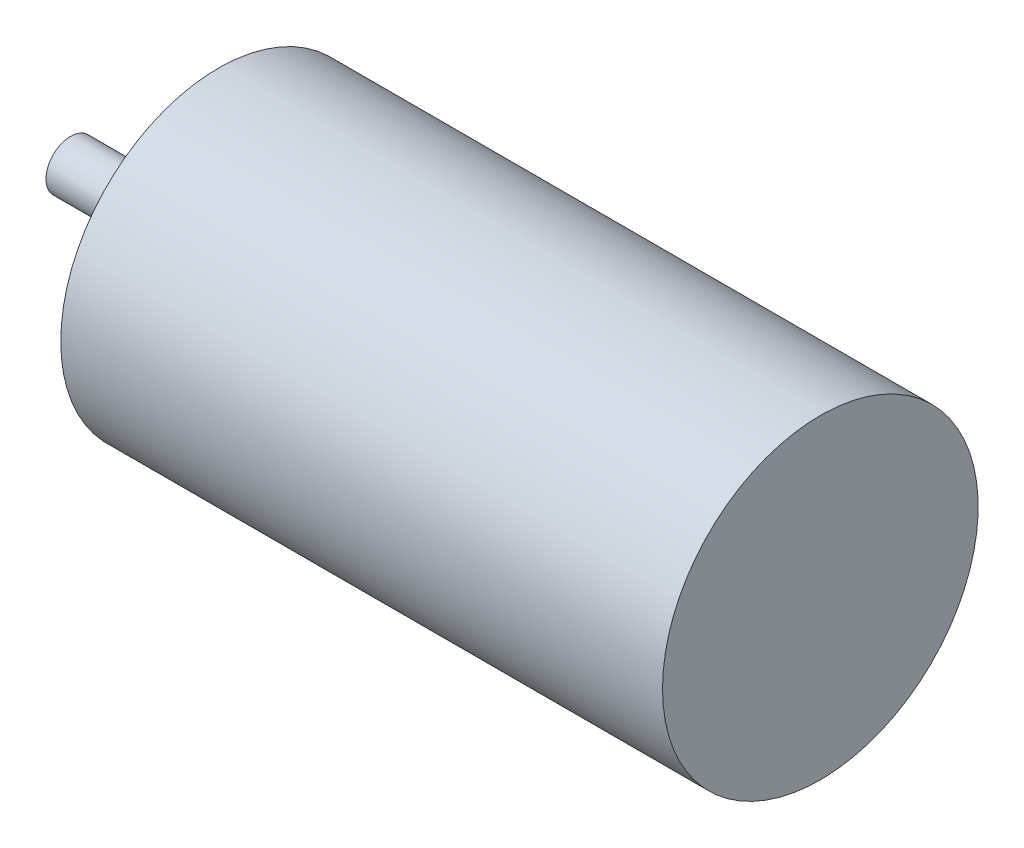
ISO-10303-21;
HEADER;
FILE_DESCRIPTION(('STEP AP214'),'2;1');
FILE_NAME('part.step','',(''),(''),'','','');
FILE_SCHEMA(('AUTOMOTIVE_DESIGN { 1 0 10303 214 1 1 1 1 }'));
ENDSEC;
DATA;
#1=APPLICATION_CONTEXT('core data for automotive mechanical design processes');
#2=APPLICATION_PROTOCOL_DEFINITION('international standard','automotive_design',2000,#1);
#3=PRODUCT_CONTEXT('',#1,'mechanical');
#4=PRODUCT('Part','Part','',(#3));
#5=PRODUCT_RELATED_PRODUCT_CATEGORY('part','',(#4));
#6=PRODUCT_DEFINITION_FORMATION('','',#4);
#7=PRODUCT_DEFINITION_CONTEXT('part definition',#1,'design');
#8=PRODUCT_DEFINITION('design','',#6,#7);
#9=PRODUCT_DEFINITION_SHAPE('','',#8);
#10=(LENGTH_UNIT() NAMED_UNIT(*) SI_UNIT(.MILLI.,.METRE.));
#11=(NAMED_UNIT(*) PLANE_ANGLE_UNIT() SI_UNIT($,.RADIAN.));
#12=(NAMED_UNIT(*) SI_UNIT($,.STERADIAN.) SOLID_ANGLE_UNIT());
#13=UNCERTAINTY_MEASURE_WITH_UNIT(LENGTH_MEASURE(1.E-05),#10,'distance_accuracy_value','');
#14=(GEOMETRIC_REPRESENTATION_CONTEXT(3) GLOBAL_UNCERTAINTY_ASSIGNED_CONTEXT((#13)) GLOBAL_UNIT_ASSIGNED_CONTEXT((#10,
#11,#12)) REPRESENTATION_CONTEXT('',''));
#15=CARTESIAN_POINT('',(0.,0.,0.));
#16=DIRECTION('',(0.,0.,1.));
#17=DIRECTION('',(1.,0.,0.));
#18=AXIS2_PLACEMENT_3D('',#15,#16,#17);
#19=CARTESIAN_POINT('',(61.,0.,0.));
#20=DIRECTION('',(-1.,0.,0.));
#21=DIRECTION('',(0.,0.,1.));
#22=AXIS2_PLACEMENT_3D('',#19,#20,#21);
#23=CYLINDRICAL_SURFACE('',#22,16.);
#24=CARTESIAN_POINT('',(61.,0.,0.));
#25=DIRECTION('',(1.,0.,0.));
#26=DIRECTION('',(0.,0.,-1.));
#27=AXIS2_PLACEMENT_3D('',#24,#25,#26);
#28=CIRCLE('',#27,16.);
#29=CARTESIAN_POINT('',(61.,0.,16.));
#30=VERTEX_POINT('',#29);
#31=EDGE_CURVE('E45',#30,#30,#28,.T.);
#32=CARTESIAN_POINT('',(0.,0.,0.));
#33=DIRECTION('',(1.,0.,0.));
#34=DIRECTION('',(0.,0.,-1.));
#35=AXIS2_PLACEMENT_3D('',#32,#33,#34);
#36=CIRCLE('',#35,16.);
#37=CARTESIAN_POINT('',(0.,0.,16.));
#38=VERTEX_POINT('',#37);
#39=EDGE_CURVE('E36',#38,#38,#36,.T.);
#40=CARTESIAN_POINT('',(61.,0.,16.));
#41=CARTESIAN_POINT('',(60.3645833333333,0.,16.));
#42=CARTESIAN_POINT('',(59.7291666666667,0.,16.));
#43=CARTESIAN_POINT('',(58.4583333333333,0.,16.));
#44=CARTESIAN_POINT('',(57.8229166666667,0.,16.));
#45=CARTESIAN_POINT('',(56.5520833333333,0.,16.));
#46=CARTESIAN_POINT('',(55.9166666666667,0.,16.));
#47=CARTESIAN_POINT('',(54.6458333333333,0.,16.));
#48=CARTESIAN_POINT('',(54.0104166666667,0.,16.));
#49=CARTESIAN_POINT('',(52.7395833333333,0.,16.));
#50=CARTESIAN_POINT('',(52.1041666666667,0.,16.));
#51=CARTESIAN_POINT('',(50.8333333333333,0.,16.));
#52=CARTESIAN_POINT('',(50.1979166666667,0.,16.));
#53=CARTESIAN_POINT('',(48.9270833333333,0.,16.));
#54=CARTESIAN_POINT('',(48.2916666666667,0.,16.));
#55=CARTESIAN_POINT('',(47.0208333333333,0.,16.));
#56=CARTESIAN_POINT('',(46.3854166666667,0.,16.));
#57=CARTESIAN_POINT('',(45.1145833333333,0.,16.));
#58=CARTESIAN_POINT('',(44.4791666666667,0.,16.));
#59=CARTESIAN_POINT('',(43.2083333333333,0.,16.));
#60=CARTESIAN_POINT('',(42.5729166666667,0.,16.));
#61=CARTESIAN_POINT('',(41.3020833333333,0.,16.));
#62=CARTESIAN_POINT('',(40.6666666666667,0.,16.));
#63=CARTESIAN_POINT('',(39.3958333333333,0.,16.));
#64=CARTESIAN_POINT('',(38.7604166666667,0.,16.));
#65=CARTESIAN_POINT('',(37.4895833333333,0.,16.));
#66=CARTESIAN_POINT('',(36.8541666666667,0.,16.));
#67=CARTESIAN_POINT('',(35.5833333333333,0.,16.));
#68=CARTESIAN_POINT('',(34.9479166666667,0.,16.));
#69=CARTESIAN_POINT('',(33.6770833333333,0.,16.));
#70=CARTESIAN_POINT('',(33.0416666666667,0.,16.));
#71=CARTESIAN_POINT('',(31.7708333333333,0.,16.));
#72=CARTESIAN_POINT('',(31.1354166666667,0.,16.));
#73=CARTESIAN_POINT('',(29.8645833333333,0.,16.));
#74=CARTESIAN_POINT('',(29.2291666666667,0.,16.));
#75=CARTESIAN_POINT('',(27.9583333333333,0.,16.));
#76=CARTESIAN_POINT('',(27.3229166666667,0.,16.));
#77=CARTESIAN_POINT('',(26.0520833333333,0.,16.));
#78=CARTESIAN_POINT('',(25.4166666666667,0.,16.));
#79=CARTESIAN_POINT('',(24.1458333333333,0.,16.));
#80=CARTESIAN_POINT('',(23.5104166666667,0.,16.));
#81=CARTESIAN_POINT('',(22.2395833333333,0.,16.));
#82=CARTESIAN_POINT('',(21.6041666666667,0.,16.));
#83=CARTESIAN_POINT('',(20.3333333333333,0.,16.));
#84=CARTESIAN_POINT('',(19.6979166666667,0.,16.));
#85=CARTESIAN_POINT('',(18.4270833333333,0.,16.));
#86=CARTESIAN_POINT('',(17.7916666666667,0.,16.));
#87=CARTESIAN_POINT('',(16.5208333333333,0.,16.));
#88=CARTESIAN_POINT('',(15.8854166666667,0.,16.));
#89=CARTESIAN_POINT('',(14.6145833333333,0.,16.));
#90=CARTESIAN_POINT('',(13.9791666666667,0.,16.));
#91=CARTESIAN_POINT('',(12.7083333333333,0.,16.));
#92=CARTESIAN_POINT('',(12.0729166666667,0.,16.));
#93=CARTESIAN_POINT('',(10.8020833333333,0.,16.));
#94=CARTESIAN_POINT('',(10.1666666666667,0.,16.));
#95=CARTESIAN_POINT('',(8.89583333333333,0.,16.));
#96=CARTESIAN_POINT('',(8.26041666666666,0.,16.));
#97=CARTESIAN_POINT('',(6.98958333333333,0.,16.));
#98=CARTESIAN_POINT('',(6.35416666666666,0.,16.));
#99=CARTESIAN_POINT('',(5.08333333333333,0.,16.));
#100=CARTESIAN_POINT('',(4.44791666666666,0.,16.));
#101=CARTESIAN_POINT('',(3.17708333333333,0.,16.));
#102=CARTESIAN_POINT('',(2.54166666666666,0.,16.));
#103=CARTESIAN_POINT('',(1.27083333333332,0.,16.));
#104=CARTESIAN_POINT('',(0.635416666666658,0.,16.));
#105=CARTESIAN_POINT('',(0.,0.,16.));
#106=B_SPLINE_CURVE_WITH_KNOTS('',3,(#40,#41,#42,#43,#44,#45,#46,#47,#48,#49,#50,#51,#52,#53,
#54,#55,#56,#57,#58,#59,#60,#61,#62,#63,#64,#65,#66,#67,#68,#69,#70,#71,#72,#73,#74,#75,#76,#77,
#78,#79,#80,#81,#82,#83,#84,#85,#86,#87,#88,#89,#90,#91,#92,#93,#94,#95,#96,#97,#98,#99,#100,
#101,#102,#103,#104,#105),.UNSPECIFIED.,.F.,.F.,(4,2,2,2,2,2,2,2,2,2,2,2,2,2,2,2,2,2,2,2,2,2,2,
2,2,2,2,2,2,2,2,2,4),(0.,1.90625000000001,3.8125,5.71875,7.62500000000001,9.53125000000001,
11.4375,13.34375,15.25,17.15625,19.0625,20.96875,22.875,24.78125,26.6875,28.59375,30.5,32.40625,
34.3125,36.21875,38.125,40.03125,41.9375,43.84375,45.75,47.65625,49.5625,51.46875,53.375,
55.28125,57.1875,59.09375,61.),.UNSPECIFIED.);
#107=EDGE_CURVE('BSEAM33',#30,#38,#106,.T.);
#108=ORIENTED_EDGE('',*,*,#31,.F.);
#109=ORIENTED_EDGE('',*,*,#39,.T.);
#110=ORIENTED_EDGE('',*,*,#107,.T.);
#111=ORIENTED_EDGE('',*,*,#107,.F.);
#112=EDGE_LOOP('',(#108,#110,#109,#111));
#113=FACE_BOUND('',#112,.T.);
#114=ADVANCED_FACE('F33',(#113),#23,.T.);
#115=CARTESIAN_POINT('',(61.,0.,0.));
#116=DIRECTION('',(1.,0.,0.));
#117=DIRECTION('',(0.,0.,-1.));
#118=AXIS2_PLACEMENT_3D('',#115,#116,#117);
#119=PLANE('',#118);
#120=ORIENTED_EDGE('',*,*,#31,.T.);
#121=EDGE_LOOP('',(#120));
#122=FACE_BOUND('',#121,.T.);
#123=ADVANCED_FACE('F98',(#122),#119,.T.);
#124=CARTESIAN_POINT('',(0.,0.,0.));
#125=DIRECTION('',(1.,0.,0.));
#126=DIRECTION('',(0.,0.,-1.));
#127=AXIS2_PLACEMENT_3D('',#124,#125,#126);
#128=PLANE('',#127);
#129=CARTESIAN_POINT('',(0.,13.5,0.));
#130=DIRECTION('',(-1.,0.,0.));
#131=DIRECTION('',(0.,0.,1.));
#132=AXIS2_PLACEMENT_3D('',#129,#130,#131);
#133=CIRCLE('',#132,1.5);
#134=CARTESIAN_POINT('',(0.,13.5,1.5));
#135=VERTEX_POINT('',#134);
#136=EDGE_CURVE('E54',#135,#135,#133,.T.);
#137=ORIENTED_EDGE('',*,*,#136,.F.);
#138=EDGE_LOOP('',(#137));
#139=FACE_BOUND('',#138,.T.);
#140=CARTESIAN_POINT('',(0.,6.74999999999933,-11.6913429510895));
#141=DIRECTION('',(-1.,0.,0.));
#142=DIRECTION('',(0.,0.,1.));
#143=AXIS2_PLACEMENT_3D('',#140,#141,#142);
#144=CIRCLE('',#143,1.50000000000072);
#145=CARTESIAN_POINT('',(0.,6.74999999999933,-10.1913429510888));
#146=VERTEX_POINT('',#145);
#147=EDGE_CURVE('E62',#146,#146,#144,.T.);
#148=ORIENTED_EDGE('',*,*,#147,.F.);
#149=EDGE_LOOP('',(#148));
#150=FACE_BOUND('',#149,.T.);
#151=CARTESIAN_POINT('',(0.,-6.75000000000067,-11.6913429510888));
#152=DIRECTION('',(-1.,0.,0.));
#153=DIRECTION('',(0.,0.,1.));
#154=AXIS2_PLACEMENT_3D('',#151,#152,#153);
#155=CIRCLE('',#154,1.50000000000141);
#156=CARTESIAN_POINT('',(0.,-6.75000000000067,-10.1913429510874));
#157=VERTEX_POINT('',#156);
#158=EDGE_CURVE('E61',#157,#157,#155,.T.);
#159=ORIENTED_EDGE('',*,*,#158,.F.);
#160=EDGE_LOOP('',(#159));
#161=FACE_BOUND('',#160,.T.);
#162=CARTESIAN_POINT('',(0.,-13.5,1.52981248970527E-12));
#163=DIRECTION('',(-1.,0.,0.));
#164=DIRECTION('',(0.,0.,1.));
#165=AXIS2_PLACEMENT_3D('',#162,#163,#164);
#166=CIRCLE('',#165,1.50000000000155);
#167=CARTESIAN_POINT('',(0.,-13.5,1.50000000000308));
#168=VERTEX_POINT('',#167);
#169=EDGE_CURVE('E79',#168,#168,#166,.T.);
#170=ORIENTED_EDGE('',*,*,#169,.F.);
#171=EDGE_LOOP('',(#170));
#172=FACE_BOUND('',#171,.T.);
#173=CARTESIAN_POINT('',(0.,-6.74999999999934,11.6913429510911));
#174=DIRECTION('',(-1.,0.,0.));
#175=DIRECTION('',(0.,0.,1.));
#176=AXIS2_PLACEMENT_3D('',#173,#174,#175);
#177=CIRCLE('',#176,1.50000000000097);
#178=CARTESIAN_POINT('',(0.,-6.74999999999934,13.191342951092));
#179=VERTEX_POINT('',#178);
#180=EDGE_CURVE('E73',#179,#179,#177,.T.);
#181=ORIENTED_EDGE('',*,*,#180,.F.);
#182=EDGE_LOOP('',(#181));
#183=FACE_BOUND('',#182,.T.);
#184=CARTESIAN_POINT('',(0.,6.75000000000067,11.6913429510903));
#185=DIRECTION('',(-1.,0.,0.));
#186=DIRECTION('',(0.,0.,1.));
#187=AXIS2_PLACEMENT_3D('',#184,#185,#186);
#188=CIRCLE('',#187,1.50000000000021);
#189=CARTESIAN_POINT('',(0.,6.75000000000067,13.1913429510905));
#190=VERTEX_POINT('',#189);
#191=EDGE_CURVE('E67',#190,#190,#188,.T.);
#192=ORIENTED_EDGE('',*,*,#191,.F.);
#193=EDGE_LOOP('',(#192));
#194=FACE_BOUND('',#193,.T.);
#195=CARTESIAN_POINT('',(0.,0.,0.));
#196=DIRECTION('',(-1.,0.,0.));
#197=DIRECTION('',(0.,0.,1.));
#198=AXIS2_PLACEMENT_3D('',#195,#196,#197);
#199=CIRCLE('',#198,11.);
#200=CARTESIAN_POINT('',(0.,0.,11.));
#201=VERTEX_POINT('',#200);
#202=EDGE_CURVE('E40',#201,#201,#199,.T.);
#203=ORIENTED_EDGE('',*,*,#202,.F.);
#204=EDGE_LOOP('',(#203));
#205=FACE_BOUND('',#204,.T.);
#206=ORIENTED_EDGE('',*,*,#39,.F.);
#207=EDGE_LOOP('',(#206));
#208=FACE_BOUND('',#207,.T.);
#209=ADVANCED_FACE('F95',(#139,#150,#161,#172,#183,#194,#205,#208),#128,.F.);
#210=CARTESIAN_POINT('',(-2.,0.,0.));
#211=DIRECTION('',(1.,0.,0.));
#212=DIRECTION('',(0.,0.,-1.));
#213=AXIS2_PLACEMENT_3D('',#210,#211,#212);
#214=CYLINDRICAL_SURFACE('',#213,11.);
#215=CARTESIAN_POINT('',(-2.,0.,0.));
#216=DIRECTION('',(-1.,0.,0.));
#217=DIRECTION('',(0.,0.,1.));
#218=AXIS2_PLACEMENT_3D('',#215,#216,#217);
#219=CIRCLE('',#218,11.);
#220=CARTESIAN_POINT('',(-2.,0.,11.));
#221=VERTEX_POINT('',#220);
#222=EDGE_CURVE('E53',#221,#221,#219,.T.);
#223=ORIENTED_EDGE('',*,*,#222,.F.);
#224=EDGE_LOOP('',(#223));
#225=FACE_BOUND('',#224,.T.);
#226=ORIENTED_EDGE('',*,*,#202,.T.);
#227=EDGE_LOOP('',(#226));
#228=FACE_BOUND('',#227,.T.);
#229=ADVANCED_FACE('F97',(#225,#228),#214,.T.);
#230=CARTESIAN_POINT('',(-2.,0.,0.));
#231=DIRECTION('',(-1.,0.,0.));
#232=DIRECTION('',(0.,0.,1.));
#233=AXIS2_PLACEMENT_3D('',#230,#231,#232);
#234=PLANE('',#233);
#235=CARTESIAN_POINT('',(-2.,0.,0.));
#236=DIRECTION('',(-1.,0.,0.));
#237=DIRECTION('',(0.,0.,1.));
#238=AXIS2_PLACEMENT_3D('',#235,#236,#237);
#239=CIRCLE('',#238,2.5);
#240=CARTESIAN_POINT('',(-2.,0.,-2.5));
#241=VERTEX_POINT('',#240);
#242=EDGE_CURVE('E10',#241,#241,#239,.T.);
#243=ORIENTED_EDGE('',*,*,#242,.F.);
#244=EDGE_LOOP('',(#243));
#245=FACE_BOUND('',#244,.T.);
#246=ORIENTED_EDGE('',*,*,#222,.T.);
#247=EDGE_LOOP('',(#246));
#248=FACE_BOUND('',#247,.T.);
#249=ADVANCED_FACE('F104',(#245,#248),#234,.T.);
#250=CARTESIAN_POINT('',(4.,6.75000000000067,11.6913429510903));
#251=DIRECTION('',(-1.,0.,0.));
#252=DIRECTION('',(0.,0.,1.));
#253=AXIS2_PLACEMENT_3D('',#250,#251,#252);
#254=CYLINDRICAL_SURFACE('',#253,1.50000000000021);
#255=CARTESIAN_POINT('',(4.,6.75000000000067,11.6913429510903));
#256=DIRECTION('',(-1.,0.,0.));
#257=DIRECTION('',(0.,0.,1.));
#258=AXIS2_PLACEMENT_3D('',#255,#256,#257);
#259=CIRCLE('',#258,1.50000000000021);
#260=CARTESIAN_POINT('',(4.,6.75000000000067,13.1913429510905));
#261=VERTEX_POINT('',#260);
#262=EDGE_CURVE('E57',#261,#261,#259,.T.);
#263=ORIENTED_EDGE('',*,*,#262,.F.);
#264=EDGE_LOOP('',(#263));
#265=FACE_BOUND('',#264,.T.);
#266=ORIENTED_EDGE('',*,*,#191,.T.);
#267=EDGE_LOOP('',(#266));
#268=FACE_BOUND('',#267,.T.);
#269=ADVANCED_FACE('F135',(#265,#268),#254,.F.);
#270=CARTESIAN_POINT('',(4.,6.75000000000067,11.6913429510903));
#271=DIRECTION('',(-1.,0.,0.));
#272=DIRECTION('',(0.,0.,1.));
#273=AXIS2_PLACEMENT_3D('',#270,#271,#272);
#274=PLANE('',#273);
#275=ORIENTED_EDGE('',*,*,#262,.T.);
#276=EDGE_LOOP('',(#275));
#277=FACE_BOUND('',#276,.T.);
#278=ADVANCED_FACE('F140',(#277),#274,.T.);
#279=CARTESIAN_POINT('',(4.,-6.74999999999934,11.6913429510911));
#280=DIRECTION('',(-1.,0.,0.));
#281=DIRECTION('',(0.,0.,1.));
#282=AXIS2_PLACEMENT_3D('',#279,#280,#281);
#283=CYLINDRICAL_SURFACE('',#282,1.50000000000097);
#284=CARTESIAN_POINT('',(4.,-6.74999999999934,11.6913429510911));
#285=DIRECTION('',(-1.,0.,0.));
#286=DIRECTION('',(0.,0.,1.));
#287=AXIS2_PLACEMENT_3D('',#284,#285,#286);
#288=CIRCLE('',#287,1.50000000000097);
#289=CARTESIAN_POINT('',(4.,-6.74999999999934,13.191342951092));
#290=VERTEX_POINT('',#289);
#291=EDGE_CURVE('E70',#290,#290,#288,.T.);
#292=ORIENTED_EDGE('',*,*,#291,.F.);
#293=EDGE_LOOP('',(#292));
#294=FACE_BOUND('',#293,.T.);
#295=ORIENTED_EDGE('',*,*,#180,.T.);
#296=EDGE_LOOP('',(#295));
#297=FACE_BOUND('',#296,.T.);
#298=ADVANCED_FACE('F150',(#294,#297),#283,.F.);
#299=CARTESIAN_POINT('',(4.,-6.74999999999934,11.6913429510911));
#300=DIRECTION('',(-1.,0.,0.));
#301=DIRECTION('',(0.,0.,1.));
#302=AXIS2_PLACEMENT_3D('',#299,#300,#301);
#303=PLANE('',#302);
#304=ORIENTED_EDGE('',*,*,#291,.T.);
#305=EDGE_LOOP('',(#304));
#306=FACE_BOUND('',#305,.T.);
#307=ADVANCED_FACE('F160',(#306),#303,.T.);
#308=CARTESIAN_POINT('',(4.,-13.5,1.52981248970527E-12));
#309=DIRECTION('',(-1.,0.,0.));
#310=DIRECTION('',(0.,0.,1.));
#311=AXIS2_PLACEMENT_3D('',#308,#309,#310);
#312=CYLINDRICAL_SURFACE('',#311,1.50000000000155);
#313=CARTESIAN_POINT('',(4.,-13.5,1.52981248970527E-12));
#314=DIRECTION('',(-1.,0.,0.));
#315=DIRECTION('',(0.,0.,1.));
#316=AXIS2_PLACEMENT_3D('',#313,#314,#315);
#317=CIRCLE('',#316,1.50000000000155);
#318=CARTESIAN_POINT('',(4.,-13.5,1.50000000000308));
#319=VERTEX_POINT('',#318);
#320=EDGE_CURVE('E76',#319,#319,#317,.T.);
#321=ORIENTED_EDGE('',*,*,#320,.F.);
#322=EDGE_LOOP('',(#321));
#323=FACE_BOUND('',#322,.T.);
#324=ORIENTED_EDGE('',*,*,#169,.T.);
#325=EDGE_LOOP('',(#324));
#326=FACE_BOUND('',#325,.T.);
#327=ADVANCED_FACE('F170',(#323,#326),#312,.F.);
#328=CARTESIAN_POINT('',(4.,-13.5,1.52981248970527E-12));
#329=DIRECTION('',(-1.,0.,0.));
#330=DIRECTION('',(0.,0.,1.));
#331=AXIS2_PLACEMENT_3D('',#328,#329,#330);
#332=PLANE('',#331);
#333=ORIENTED_EDGE('',*,*,#320,.T.);
#334=EDGE_LOOP('',(#333));
#335=FACE_BOUND('',#334,.T.);
#336=ADVANCED_FACE('F180',(#335),#332,.T.);
#337=CARTESIAN_POINT('',(4.,-6.75000000000067,-11.6913429510888));
#338=DIRECTION('',(-1.,0.,0.));
#339=DIRECTION('',(0.,0.,1.));
#340=AXIS2_PLACEMENT_3D('',#337,#338,#339);
#341=CYLINDRICAL_SURFACE('',#340,1.50000000000141);
#342=CARTESIAN_POINT('',(4.,-6.75000000000067,-11.6913429510888));
#343=DIRECTION('',(-1.,0.,0.));
#344=DIRECTION('',(0.,0.,1.));
#345=AXIS2_PLACEMENT_3D('',#342,#343,#344);
#346=CIRCLE('',#345,1.50000000000141);
#347=CARTESIAN_POINT('',(4.,-6.75000000000067,-10.1913429510874));
#348=VERTEX_POINT('',#347);
#349=EDGE_CURVE('E82',#348,#348,#346,.T.);
#350=ORIENTED_EDGE('',*,*,#349,.F.);
#351=EDGE_LOOP('',(#350));
#352=FACE_BOUND('',#351,.T.);
#353=ORIENTED_EDGE('',*,*,#158,.T.);
#354=EDGE_LOOP('',(#353));
#355=FACE_BOUND('',#354,.T.);
#356=ADVANCED_FACE('F190',(#352,#355),#341,.F.);
#357=CARTESIAN_POINT('',(4.,-6.75000000000067,-11.6913429510888));
#358=DIRECTION('',(-1.,0.,0.));
#359=DIRECTION('',(0.,0.,1.));
#360=AXIS2_PLACEMENT_3D('',#357,#358,#359);
#361=PLANE('',#360);
#362=ORIENTED_EDGE('',*,*,#349,.T.);
#363=EDGE_LOOP('',(#362));
#364=FACE_BOUND('',#363,.T.);
#365=ADVANCED_FACE('F200',(#364),#361,.T.);
#366=CARTESIAN_POINT('',(4.,6.74999999999933,-11.6913429510895));
#367=DIRECTION('',(-1.,0.,0.));
#368=DIRECTION('',(0.,0.,1.));
#369=AXIS2_PLACEMENT_3D('',#366,#367,#368);
#370=CYLINDRICAL_SURFACE('',#369,1.50000000000072);
#371=CARTESIAN_POINT('',(4.,6.74999999999933,-11.6913429510895));
#372=DIRECTION('',(-1.,0.,0.));
#373=DIRECTION('',(0.,0.,1.));
#374=AXIS2_PLACEMENT_3D('',#371,#372,#373);
#375=CIRCLE('',#374,1.50000000000072);
#376=CARTESIAN_POINT('',(4.,6.74999999999933,-10.1913429510888));
#377=VERTEX_POINT('',#376);
#378=EDGE_CURVE('E58',#377,#377,#375,.T.);
#379=ORIENTED_EDGE('',*,*,#378,.F.);
#380=EDGE_LOOP('',(#379));
#381=FACE_BOUND('',#380,.T.);
#382=ORIENTED_EDGE('',*,*,#147,.T.);
#383=EDGE_LOOP('',(#382));
#384=FACE_BOUND('',#383,.T.);
#385=ADVANCED_FACE('F210',(#381,#384),#370,.F.);
#386=CARTESIAN_POINT('',(4.,6.74999999999933,-11.6913429510895));
#387=DIRECTION('',(-1.,0.,0.));
#388=DIRECTION('',(0.,0.,1.));
#389=AXIS2_PLACEMENT_3D('',#386,#387,#388);
#390=PLANE('',#389);
#391=ORIENTED_EDGE('',*,*,#378,.T.);
#392=EDGE_LOOP('',(#391));
#393=FACE_BOUND('',#392,.T.);
#394=ADVANCED_FACE('F220',(#393),#390,.T.);
#395=CARTESIAN_POINT('',(4.,13.5,0.));
#396=DIRECTION('',(-1.,0.,0.));
#397=DIRECTION('',(0.,0.,1.));
#398=AXIS2_PLACEMENT_3D('',#395,#396,#397);
#399=CYLINDRICAL_SURFACE('',#398,1.5);
#400=CARTESIAN_POINT('',(4.,13.5,0.));
#401=DIRECTION('',(-1.,0.,0.));
#402=DIRECTION('',(0.,0.,1.));
#403=AXIS2_PLACEMENT_3D('',#400,#401,#402);
#404=CIRCLE('',#403,1.5);
#405=CARTESIAN_POINT('',(4.,13.5,1.5));
#406=VERTEX_POINT('',#405);
#407=EDGE_CURVE('E50',#406,#406,#404,.T.);
#408=ORIENTED_EDGE('',*,*,#407,.F.);
#409=EDGE_LOOP('',(#408));
#410=FACE_BOUND('',#409,.T.);
#411=ORIENTED_EDGE('',*,*,#136,.T.);
#412=EDGE_LOOP('',(#411));
#413=FACE_BOUND('',#412,.T.);
#414=ADVANCED_FACE('F230',(#410,#413),#399,.F.);
#415=CARTESIAN_POINT('',(4.,13.5,0.));
#416=DIRECTION('',(-1.,0.,0.));
#417=DIRECTION('',(0.,0.,1.));
#418=AXIS2_PLACEMENT_3D('',#415,#416,#417);
#419=PLANE('',#418);
#420=ORIENTED_EDGE('',*,*,#407,.T.);
#421=EDGE_LOOP('',(#420));
#422=FACE_BOUND('',#421,.T.);
#423=ADVANCED_FACE('F240',(#422),#419,.T.);
#424=CARTESIAN_POINT('',(-15.,0.,0.));
#425=DIRECTION('',(1.,0.,0.));
#426=DIRECTION('',(0.,0.,-1.));
#427=AXIS2_PLACEMENT_3D('',#424,#425,#426);
#428=CYLINDRICAL_SURFACE('',#427,2.5);
#429=CARTESIAN_POINT('',(-15.,0.,0.));
#430=DIRECTION('',(-1.,0.,0.));
#431=DIRECTION('',(0.,0.,1.));
#432=AXIS2_PLACEMENT_3D('',#429,#430,#431);
#433=CIRCLE('',#432,2.5);
#434=CARTESIAN_POINT('',(-15.,0.,-2.5));
#435=VERTEX_POINT('',#434);
#436=EDGE_CURVE('E49',#435,#435,#433,.T.);
#437=CARTESIAN_POINT('',(-15.,0.,-2.5));
#438=CARTESIAN_POINT('',(-14.8645833333333,0.,-2.5));
#439=CARTESIAN_POINT('',(-14.7291666666667,0.,-2.5));
#440=CARTESIAN_POINT('',(-14.4583333333333,0.,-2.5));
#441=CARTESIAN_POINT('',(-14.3229166666667,0.,-2.5));
#442=CARTESIAN_POINT('',(-14.0520833333333,0.,-2.5));
#443=CARTESIAN_POINT('',(-13.9166666666667,0.,-2.5));
#444=CARTESIAN_POINT('',(-13.6458333333333,0.,-2.5));
#445=CARTESIAN_POINT('',(-13.5104166666667,0.,-2.5));
#446=CARTESIAN_POINT('',(-13.2395833333333,0.,-2.5));
#447=CARTESIAN_POINT('',(-13.1041666666667,0.,-2.5));
#448=CARTESIAN_POINT('',(-12.8333333333333,0.,-2.5));
#449=CARTESIAN_POINT('',(-12.6979166666667,0.,-2.5));
#450=CARTESIAN_POINT('',(-12.4270833333333,0.,-2.5));
#451=CARTESIAN_POINT('',(-12.2916666666667,0.,-2.5));
#452=CARTESIAN_POINT('',(-12.0208333333333,0.,-2.5));
#453=CARTESIAN_POINT('',(-11.8854166666667,0.,-2.5));
#454=CARTESIAN_POINT('',(-11.6145833333333,0.,-2.5));
#455=CARTESIAN_POINT('',(-11.4791666666667,0.,-2.5));
#456=CARTESIAN_POINT('',(-11.2083333333333,0.,-2.5));
#457=CARTESIAN_POINT('',(-11.0729166666667,0.,-2.5));
#458=CARTESIAN_POINT('',(-10.8020833333333,0.,-2.5));
#459=CARTESIAN_POINT('',(-10.6666666666667,0.,-2.5));
#460=CARTESIAN_POINT('',(-10.3958333333333,0.,-2.5));
#461=CARTESIAN_POINT('',(-10.2604166666667,0.,-2.5));
#462=CARTESIAN_POINT('',(-9.98958333333333,0.,-2.5));
#463=CARTESIAN_POINT('',(-9.85416666666667,0.,-2.5));
#464=CARTESIAN_POINT('',(-9.58333333333333,0.,-2.5));
#465=CARTESIAN_POINT('',(-9.44791666666667,0.,-2.5));
#466=CARTESIAN_POINT('',(-9.17708333333333,0.,-2.5));
#467=CARTESIAN_POINT('',(-9.04166666666667,0.,-2.5));
#468=CARTESIAN_POINT('',(-8.77083333333333,0.,-2.5));
#469=CARTESIAN_POINT('',(-8.63541666666667,0.,-2.5));
#470=CARTESIAN_POINT('',(-8.36458333333333,0.,-2.5));
#471=CARTESIAN_POINT('',(-8.22916666666667,0.,-2.5));
#472=CARTESIAN_POINT('',(-7.95833333333333,0.,-2.5));
#473=CARTESIAN_POINT('',(-7.82291666666667,0.,-2.5));
#474=CARTESIAN_POINT('',(-7.55208333333333,0.,-2.5));
#475=CARTESIAN_POINT('',(-7.41666666666667,0.,-2.5));
#476=CARTESIAN_POINT('',(-7.14583333333333,0.,-2.5));
#477=CARTESIAN_POINT('',(-7.01041666666667,0.,-2.5));
#478=CARTESIAN_POINT('',(-6.73958333333333,0.,-2.5));
#479=CARTESIAN_POINT('',(-6.60416666666667,0.,-2.5));
#480=CARTESIAN_POINT('',(-6.33333333333333,0.,-2.5));
#481=CARTESIAN_POINT('',(-6.19791666666667,0.,-2.5));
#482=CARTESIAN_POINT('',(-5.92708333333333,0.,-2.5));
#483=CARTESIAN_POINT('',(-5.79166666666667,0.,-2.5));
#484=CARTESIAN_POINT('',(-5.52083333333333,0.,-2.5));
#485=CARTESIAN_POINT('',(-5.38541666666667,0.,-2.5));
#486=CARTESIAN_POINT('',(-5.11458333333333,0.,-2.5));
#487=CARTESIAN_POINT('',(-4.97916666666667,0.,-2.5));
#488=CARTESIAN_POINT('',(-4.70833333333333,0.,-2.5));
#489=CARTESIAN_POINT('',(-4.57291666666667,0.,-2.5));
#490=CARTESIAN_POINT('',(-4.30208333333333,0.,-2.5));
#491=CARTESIAN_POINT('',(-4.16666666666667,0.,-2.5));
#492=CARTESIAN_POINT('',(-3.89583333333333,0.,-2.5));
#493=CARTESIAN_POINT('',(-3.76041666666667,0.,-2.5));
#494=CARTESIAN_POINT('',(-3.48958333333333,0.,-2.5));
#495=CARTESIAN_POINT('',(-3.35416666666667,0.,-2.5));
#496=CARTESIAN_POINT('',(-3.08333333333333,0.,-2.5));
#497=CARTESIAN_POINT('',(-2.94791666666667,0.,-2.5));
#498=CARTESIAN_POINT('',(-2.67708333333333,0.,-2.5));
#499=CARTESIAN_POINT('',(-2.54166666666667,0.,-2.5));
#500=CARTESIAN_POINT('',(-2.27083333333333,0.,-2.5));
#501=CARTESIAN_POINT('',(-2.13541666666667,0.,-2.5));
#502=CARTESIAN_POINT('',(-2.,0.,-2.5));
#503=B_SPLINE_CURVE_WITH_KNOTS('',3,(#437,#438,#439,#440,#441,#442,#443,#444,#445,#446,#447,
#448,#449,#450,#451,#452,#453,#454,#455,#456,#457,#458,#459,#460,#461,#462,#463,#464,#465,#466,
#467,#468,#469,#470,#471,#472,#473,#474,#475,#476,#477,#478,#479,#480,#481,#482,#483,#484,#485,
#486,#487,#488,#489,#490,#491,#492,#493,#494,#495,#496,#497,#498,#499,#500,#501,#502),
.UNSPECIFIED.,.F.,.F.,(4,2,2,2,2,2,2,2,2,2,2,2,2,2,2,2,2,2,2,2,2,2,2,2,2,2,2,2,2,2,2,2,4),(0.,
0.406249999999999,0.812499999999999,1.21875,1.625,2.03125,2.4375,2.84375,3.25,3.65625,4.0625,
4.46875,4.875,5.28125,5.6875,6.09375,6.5,6.90625,7.3125,7.71875,8.125,8.53125,8.9375,9.34375,
9.75,10.15625,10.5625,10.96875,11.375,11.78125,12.1875,12.59375,13.),.UNSPECIFIED.);
#504=EDGE_CURVE('BSEAM250',#435,#241,#503,.T.);
#505=ORIENTED_EDGE('',*,*,#436,.F.);
#506=ORIENTED_EDGE('',*,*,#242,.T.);
#507=ORIENTED_EDGE('',*,*,#504,.T.);
#508=ORIENTED_EDGE('',*,*,#504,.F.);
#509=EDGE_LOOP('',(#505,#507,#506,#508));
#510=FACE_BOUND('',#509,.T.);
#511=ADVANCED_FACE('F250',(#510),#428,.T.);
#512=CARTESIAN_POINT('',(-15.,0.,0.));
#513=DIRECTION('',(-1.,0.,0.));
#514=DIRECTION('',(0.,0.,1.));
#515=AXIS2_PLACEMENT_3D('',#512,#513,#514);
#516=PLANE('',#515);
#517=ORIENTED_EDGE('',*,*,#436,.T.);
#518=EDGE_LOOP('',(#517));
#519=FACE_BOUND('',#518,.T.);
#520=ADVANCED_FACE('F267',(#519),#516,.T.);
#521=CLOSED_SHELL('',(#114,#123,#209,#229,#249,#269,#278,#298,#307,#327,#336,#356,#365,#385,
#394,#414,#423,#511,#520));
#522=MANIFOLD_SOLID_BREP('B2',#521);
#523=ADVANCED_BREP_SHAPE_REPRESENTATION('',(#18,#522),#14);
#524=SHAPE_DEFINITION_REPRESENTATION(#9,#523);
ENDSEC;
END-ISO-10303-21;
